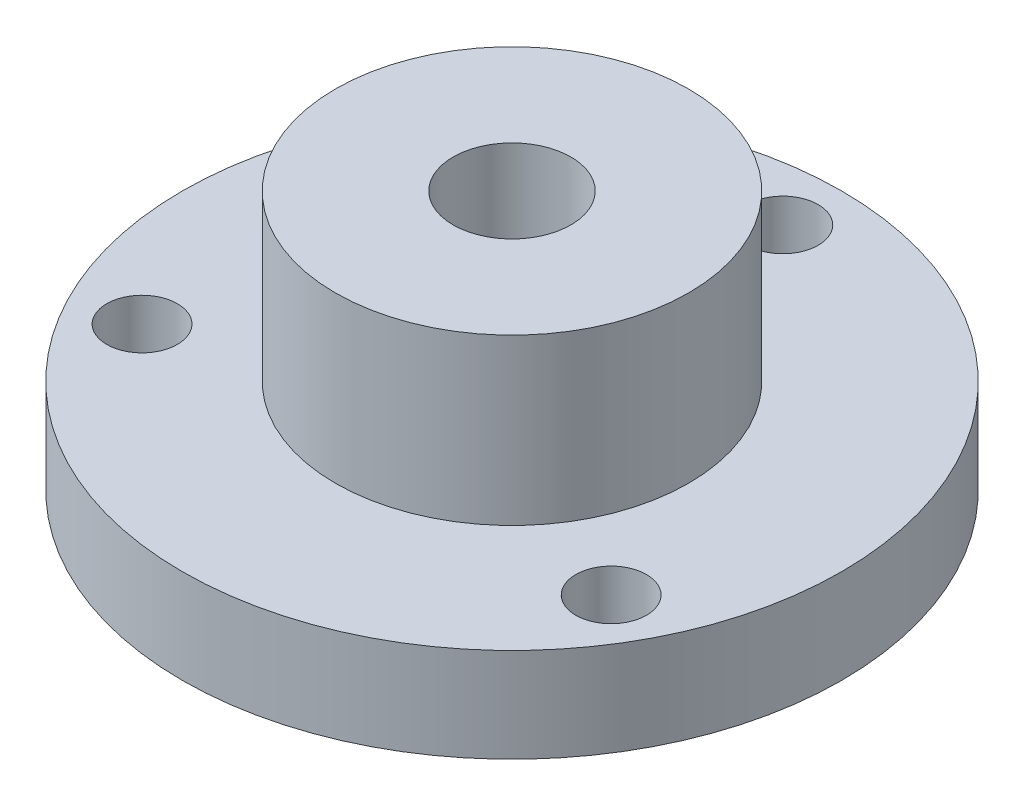
ISO-10303-21;
HEADER;
FILE_DESCRIPTION(('STEP AP214'),'2;1');
FILE_NAME('part.step','',(''),(''),'','','');
FILE_SCHEMA(('AUTOMOTIVE_DESIGN { 1 0 10303 214 1 1 1 1 }'));
ENDSEC;
DATA;
#1=APPLICATION_CONTEXT('core data for automotive mechanical design processes');
#2=APPLICATION_PROTOCOL_DEFINITION('international standard','automotive_design',2000,#1);
#3=PRODUCT_CONTEXT('',#1,'mechanical');
#4=PRODUCT('Part','Part','',(#3));
#5=PRODUCT_RELATED_PRODUCT_CATEGORY('part','',(#4));
#6=PRODUCT_DEFINITION_FORMATION('','',#4);
#7=PRODUCT_DEFINITION_CONTEXT('part definition',#1,'design');
#8=PRODUCT_DEFINITION('design','',#6,#7);
#9=PRODUCT_DEFINITION_SHAPE('','',#8);
#10=(LENGTH_UNIT() NAMED_UNIT(*) SI_UNIT(.MILLI.,.METRE.));
#11=(NAMED_UNIT(*) PLANE_ANGLE_UNIT() SI_UNIT($,.RADIAN.));
#12=(NAMED_UNIT(*) SI_UNIT($,.STERADIAN.) SOLID_ANGLE_UNIT());
#13=UNCERTAINTY_MEASURE_WITH_UNIT(LENGTH_MEASURE(1.E-05),#10,'distance_accuracy_value','');
#14=(GEOMETRIC_REPRESENTATION_CONTEXT(3) GLOBAL_UNCERTAINTY_ASSIGNED_CONTEXT((#13)) GLOBAL_UNIT_ASSIGNED_CONTEXT((#10,
#11,#12)) REPRESENTATION_CONTEXT('',''));
#15=CARTESIAN_POINT('',(0.,0.,0.));
#16=DIRECTION('',(0.,0.,1.));
#17=DIRECTION('',(1.,0.,0.));
#18=AXIS2_PLACEMENT_3D('',#15,#16,#17);
#19=CARTESIAN_POINT('',(0.,4.,0.));
#20=DIRECTION('',(0.,1.,0.));
#21=DIRECTION('',(0.,0.,1.));
#22=AXIS2_PLACEMENT_3D('',#19,#20,#21);
#23=PLANE('',#22);
#24=CARTESIAN_POINT('',(0.,4.,0.));
#25=DIRECTION('',(0.,1.,0.));
#26=DIRECTION('',(0.,0.,1.));
#27=AXIS2_PLACEMENT_3D('',#24,#25,#26);
#28=CIRCLE('',#27,7.5);
#29=CARTESIAN_POINT('',(0.,4.,7.5));
#30=VERTEX_POINT('',#29);
#31=EDGE_CURVE('E10',#30,#30,#28,.T.);
#32=ORIENTED_EDGE('',*,*,#31,.F.);
#33=EDGE_LOOP('',(#32));
#34=FACE_BOUND('',#33,.T.);
#35=CARTESIAN_POINT('',(9.95929214352178,4.,5.74999999999957));
#36=DIRECTION('',(0.,1.,0.));
#37=DIRECTION('',(0.,0.,1.));
#38=AXIS2_PLACEMENT_3D('',#35,#36,#37);
#39=CIRCLE('',#38,1.50000000000063);
#40=CARTESIAN_POINT('',(9.95929214352178,4.,7.25000000000021));
#41=VERTEX_POINT('',#40);
#42=EDGE_CURVE('E69',#41,#41,#39,.T.);
#43=ORIENTED_EDGE('',*,*,#42,.F.);
#44=EDGE_LOOP('',(#43));
#45=FACE_BOUND('',#44,.T.);
#46=CARTESIAN_POINT('',(0.,4.,0.));
#47=DIRECTION('',(0.,1.,0.));
#48=DIRECTION('',(0.,0.,1.));
#49=AXIS2_PLACEMENT_3D('',#46,#47,#48);
#50=CIRCLE('',#49,14.);
#51=CARTESIAN_POINT('',(0.,4.,14.));
#52=VERTEX_POINT('',#51);
#53=EDGE_CURVE('E50',#52,#52,#50,.T.);
#54=ORIENTED_EDGE('',*,*,#53,.T.);
#55=EDGE_LOOP('',(#54));
#56=FACE_BOUND('',#55,.T.);
#57=CARTESIAN_POINT('',(0.,4.,-11.5));
#58=DIRECTION('',(0.,1.,0.));
#59=DIRECTION('',(0.,0.,1.));
#60=AXIS2_PLACEMENT_3D('',#57,#58,#59);
#61=CIRCLE('',#60,1.5);
#62=CARTESIAN_POINT('',(0.,4.,-10.));
#63=VERTEX_POINT('',#62);
#64=EDGE_CURVE('E77',#63,#63,#61,.T.);
#65=ORIENTED_EDGE('',*,*,#64,.F.);
#66=EDGE_LOOP('',(#65));
#67=FACE_BOUND('',#66,.T.);
#68=CARTESIAN_POINT('',(-9.95929214352031,4.,5.75000000000043));
#69=DIRECTION('',(0.,1.,0.));
#70=DIRECTION('',(0.,0.,1.));
#71=AXIS2_PLACEMENT_3D('',#68,#69,#70);
#72=CIRCLE('',#71,1.50000000000093);
#73=CARTESIAN_POINT('',(-9.95929214352031,4.,7.25000000000136));
#74=VERTEX_POINT('',#73);
#75=EDGE_CURVE('E60',#74,#74,#72,.T.);
#76=ORIENTED_EDGE('',*,*,#75,.F.);
#77=EDGE_LOOP('',(#76));
#78=FACE_BOUND('',#77,.T.);
#79=ADVANCED_FACE('F41',(#34,#45,#56,#67,#78),#23,.T.);
#80=CARTESIAN_POINT('',(0.,0.,0.));
#81=DIRECTION('',(0.,1.,0.));
#82=DIRECTION('',(0.,0.,1.));
#83=AXIS2_PLACEMENT_3D('',#80,#81,#82);
#84=PLANE('',#83);
#85=CARTESIAN_POINT('',(0.,0.,0.));
#86=DIRECTION('',(0.,1.,0.));
#87=DIRECTION('',(0.,0.,1.));
#88=AXIS2_PLACEMENT_3D('',#85,#86,#87);
#89=CIRCLE('',#88,14.);
#90=CARTESIAN_POINT('',(0.,0.,14.));
#91=VERTEX_POINT('',#90);
#92=EDGE_CURVE('E45',#91,#91,#89,.T.);
#93=ORIENTED_EDGE('',*,*,#92,.F.);
#94=EDGE_LOOP('',(#93));
#95=FACE_BOUND('',#94,.T.);
#96=CARTESIAN_POINT('',(0.,0.,-11.5));
#97=DIRECTION('',(0.,1.,0.));
#98=DIRECTION('',(0.,0.,1.));
#99=AXIS2_PLACEMENT_3D('',#96,#97,#98);
#100=CIRCLE('',#99,1.5);
#101=CARTESIAN_POINT('',(0.,0.,-10.));
#102=VERTEX_POINT('',#101);
#103=EDGE_CURVE('E73',#102,#102,#100,.T.);
#104=ORIENTED_EDGE('',*,*,#103,.T.);
#105=EDGE_LOOP('',(#104));
#106=FACE_BOUND('',#105,.T.);
#107=CARTESIAN_POINT('',(9.95929214352178,0.,5.74999999999957));
#108=DIRECTION('',(0.,1.,0.));
#109=DIRECTION('',(0.,0.,1.));
#110=AXIS2_PLACEMENT_3D('',#107,#108,#109);
#111=CIRCLE('',#110,1.50000000000063);
#112=CARTESIAN_POINT('',(9.95929214352178,0.,7.25000000000021));
#113=VERTEX_POINT('',#112);
#114=EDGE_CURVE('E64',#113,#113,#111,.T.);
#115=ORIENTED_EDGE('',*,*,#114,.T.);
#116=EDGE_LOOP('',(#115));
#117=FACE_BOUND('',#116,.T.);
#118=CARTESIAN_POINT('',(-9.95929214352031,0.,5.75000000000043));
#119=DIRECTION('',(0.,1.,0.));
#120=DIRECTION('',(0.,0.,1.));
#121=AXIS2_PLACEMENT_3D('',#118,#119,#120);
#122=CIRCLE('',#121,1.50000000000093);
#123=CARTESIAN_POINT('',(-9.95929214352031,0.,7.25000000000136));
#124=VERTEX_POINT('',#123);
#125=EDGE_CURVE('E65',#124,#124,#122,.T.);
#126=ORIENTED_EDGE('',*,*,#125,.T.);
#127=EDGE_LOOP('',(#126));
#128=FACE_BOUND('',#127,.T.);
#129=ADVANCED_FACE('F85',(#95,#106,#117,#128),#84,.F.);
#130=CARTESIAN_POINT('',(0.,4.,0.));
#131=DIRECTION('',(0.,-1.,0.));
#132=DIRECTION('',(0.,0.,-1.));
#133=AXIS2_PLACEMENT_3D('',#130,#131,#132);
#134=CYLINDRICAL_SURFACE('',#133,14.);
#135=ORIENTED_EDGE('',*,*,#53,.F.);
#136=EDGE_LOOP('',(#135));
#137=FACE_BOUND('',#136,.T.);
#138=ORIENTED_EDGE('',*,*,#92,.T.);
#139=EDGE_LOOP('',(#138));
#140=FACE_BOUND('',#139,.T.);
#141=ADVANCED_FACE('F43',(#137,#140),#134,.T.);
#142=CARTESIAN_POINT('',(0.,4.,-11.5));
#143=DIRECTION('',(0.,-1.,0.));
#144=DIRECTION('',(0.,0.,-1.));
#145=AXIS2_PLACEMENT_3D('',#142,#143,#144);
#146=CYLINDRICAL_SURFACE('',#145,1.5);
#147=ORIENTED_EDGE('',*,*,#64,.T.);
#148=EDGE_LOOP('',(#147));
#149=FACE_BOUND('',#148,.T.);
#150=ORIENTED_EDGE('',*,*,#103,.F.);
#151=EDGE_LOOP('',(#150));
#152=FACE_BOUND('',#151,.T.);
#153=ADVANCED_FACE('F88',(#149,#152),#146,.F.);
#154=CARTESIAN_POINT('',(9.95929214352178,4.,5.74999999999957));
#155=DIRECTION('',(0.,-1.,0.));
#156=DIRECTION('',(0.,0.,-1.));
#157=AXIS2_PLACEMENT_3D('',#154,#155,#156);
#158=CYLINDRICAL_SURFACE('',#157,1.50000000000063);
#159=ORIENTED_EDGE('',*,*,#42,.T.);
#160=EDGE_LOOP('',(#159));
#161=FACE_BOUND('',#160,.T.);
#162=ORIENTED_EDGE('',*,*,#114,.F.);
#163=EDGE_LOOP('',(#162));
#164=FACE_BOUND('',#163,.T.);
#165=ADVANCED_FACE('F90',(#161,#164),#158,.F.);
#166=CARTESIAN_POINT('',(-9.95929214352031,4.,5.75000000000043));
#167=DIRECTION('',(0.,-1.,0.));
#168=DIRECTION('',(0.,0.,-1.));
#169=AXIS2_PLACEMENT_3D('',#166,#167,#168);
#170=CYLINDRICAL_SURFACE('',#169,1.50000000000093);
#171=ORIENTED_EDGE('',*,*,#75,.T.);
#172=EDGE_LOOP('',(#171));
#173=FACE_BOUND('',#172,.T.);
#174=ORIENTED_EDGE('',*,*,#125,.F.);
#175=EDGE_LOOP('',(#174));
#176=FACE_BOUND('',#175,.T.);
#177=ADVANCED_FACE('F97',(#173,#176),#170,.F.);
#178=CARTESIAN_POINT('',(0.,11.,0.));
#179=DIRECTION('',(0.,1.,0.));
#180=DIRECTION('',(0.,0.,1.));
#181=AXIS2_PLACEMENT_3D('',#178,#179,#180);
#182=PLANE('',#181);
#183=CARTESIAN_POINT('',(0.,11.,0.));
#184=DIRECTION('',(0.,1.,0.));
#185=DIRECTION('',(0.,0.,1.));
#186=AXIS2_PLACEMENT_3D('',#183,#184,#185);
#187=CIRCLE('',#186,7.5);
#188=CARTESIAN_POINT('',(0.,11.,7.5));
#189=VERTEX_POINT('',#188);
#190=EDGE_CURVE('E58',#189,#189,#187,.T.);
#191=ORIENTED_EDGE('',*,*,#190,.T.);
#192=EDGE_LOOP('',(#191));
#193=FACE_BOUND('',#192,.T.);
#194=CARTESIAN_POINT('',(0.,11.,0.));
#195=DIRECTION('',(0.,1.,0.));
#196=DIRECTION('',(0.,0.,1.));
#197=AXIS2_PLACEMENT_3D('',#194,#195,#196);
#198=CIRCLE('',#197,2.5);
#199=CARTESIAN_POINT('',(0.,11.,2.5));
#200=VERTEX_POINT('',#199);
#201=EDGE_CURVE('E124',#200,#200,#198,.T.);
#202=ORIENTED_EDGE('',*,*,#201,.F.);
#203=EDGE_LOOP('',(#202));
#204=FACE_BOUND('',#203,.T.);
#205=ADVANCED_FACE('F133',(#193,#204),#182,.T.);
#206=CARTESIAN_POINT('',(0.,11.,0.));
#207=DIRECTION('',(0.,-1.,0.));
#208=DIRECTION('',(0.,0.,-1.));
#209=AXIS2_PLACEMENT_3D('',#206,#207,#208);
#210=CYLINDRICAL_SURFACE('',#209,7.5);
#211=ORIENTED_EDGE('',*,*,#190,.F.);
#212=EDGE_LOOP('',(#211));
#213=FACE_BOUND('',#212,.T.);
#214=ORIENTED_EDGE('',*,*,#31,.T.);
#215=EDGE_LOOP('',(#214));
#216=FACE_BOUND('',#215,.T.);
#217=ADVANCED_FACE('F116',(#213,#216),#210,.T.);
#218=CARTESIAN_POINT('',(0.,11.,0.));
#219=DIRECTION('',(0.,-1.,0.));
#220=DIRECTION('',(0.,0.,-1.));
#221=AXIS2_PLACEMENT_3D('',#218,#219,#220);
#222=CYLINDRICAL_SURFACE('',#221,2.5);
#223=ORIENTED_EDGE('',*,*,#201,.T.);
#224=EDGE_LOOP('',(#223));
#225=FACE_BOUND('',#224,.T.);
#226=CARTESIAN_POINT('',(0.,4.,0.));
#227=DIRECTION('',(0.,1.,0.));
#228=DIRECTION('',(0.,0.,1.));
#229=AXIS2_PLACEMENT_3D('',#226,#227,#228);
#230=CIRCLE('',#229,2.5);
#231=CARTESIAN_POINT('',(0.,4.,2.5));
#232=VERTEX_POINT('',#231);
#233=EDGE_CURVE('E121',#232,#232,#230,.T.);
#234=ORIENTED_EDGE('',*,*,#233,.F.);
#235=EDGE_LOOP('',(#234));
#236=FACE_BOUND('',#235,.T.);
#237=ADVANCED_FACE('F111',(#225,#236),#222,.F.);
#238=ORIENTED_EDGE('',*,*,#233,.T.);
#239=EDGE_LOOP('',(#238));
#240=FACE_BOUND('',#239,.T.);
#241=ADVANCED_FACE('F104',(#240),#23,.T.);
#242=CLOSED_SHELL('',(#79,#129,#141,#153,#165,#177,#205,#217,#237,#241));
#243=MANIFOLD_SOLID_BREP('B2',#242);
#244=ADVANCED_BREP_SHAPE_REPRESENTATION('',(#18,#243),#14);
#245=SHAPE_DEFINITION_REPRESENTATION(#9,#244);
ENDSEC;
END-ISO-10303-21;
